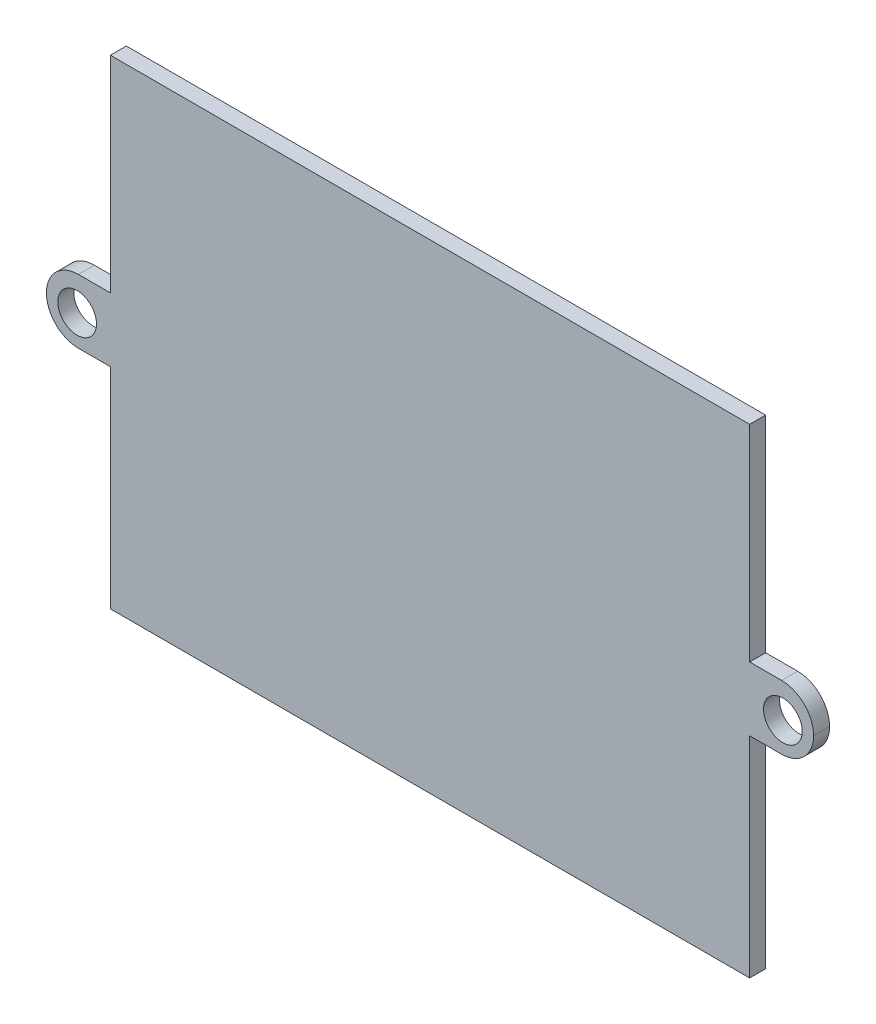
ISO-10303-21;
HEADER;
FILE_DESCRIPTION(('STEP AP214'),'2;1');
FILE_NAME('part.step','',(''),(''),'','','');
FILE_SCHEMA(('AUTOMOTIVE_DESIGN { 1 0 10303 214 1 1 1 1 }'));
ENDSEC;
DATA;
#1=APPLICATION_CONTEXT('core data for automotive mechanical design processes');
#2=APPLICATION_PROTOCOL_DEFINITION('international standard','automotive_design',2000,#1);
#3=PRODUCT_CONTEXT('',#1,'mechanical');
#4=PRODUCT('Part','Part','',(#3));
#5=PRODUCT_RELATED_PRODUCT_CATEGORY('part','',(#4));
#6=PRODUCT_DEFINITION_FORMATION('','',#4);
#7=PRODUCT_DEFINITION_CONTEXT('part definition',#1,'design');
#8=PRODUCT_DEFINITION('design','',#6,#7);
#9=PRODUCT_DEFINITION_SHAPE('','',#8);
#10=(LENGTH_UNIT() NAMED_UNIT(*) SI_UNIT(.MILLI.,.METRE.));
#11=(NAMED_UNIT(*) PLANE_ANGLE_UNIT() SI_UNIT($,.RADIAN.));
#12=(NAMED_UNIT(*) SI_UNIT($,.STERADIAN.) SOLID_ANGLE_UNIT());
#13=UNCERTAINTY_MEASURE_WITH_UNIT(LENGTH_MEASURE(1.E-05),#10,'distance_accuracy_value','');
#14=(GEOMETRIC_REPRESENTATION_CONTEXT(3) GLOBAL_UNCERTAINTY_ASSIGNED_CONTEXT((#13)) GLOBAL_UNIT_ASSIGNED_CONTEXT((#10,
#11,#12)) REPRESENTATION_CONTEXT('',''));
#15=CARTESIAN_POINT('',(0.,0.,0.));
#16=DIRECTION('',(0.,0.,1.));
#17=DIRECTION('',(1.,0.,0.));
#18=AXIS2_PLACEMENT_3D('',#15,#16,#17);
#19=CARTESIAN_POINT('',(100.,75.,5.));
#20=DIRECTION('',(-1.,0.,0.));
#21=DIRECTION('',(0.,-1.,0.));
#22=AXIS2_PLACEMENT_3D('',#19,#20,#21);
#23=PLANE('',#22);
#24=DIRECTION('',(0.,0.,-1.));
#25=VECTOR('',#24,1.);
#26=CARTESIAN_POINT('',(100.,-9.37884771933413,5.));
#27=LINE('',#26,#25);
#28=CARTESIAN_POINT('',(100.,-9.37884771933413,5.));
#29=VERTEX_POINT('',#28);
#30=CARTESIAN_POINT('',(100.,-9.37884771933413,0.));
#31=VERTEX_POINT('',#30);
#32=EDGE_CURVE('E158',#29,#31,#27,.T.);
#33=ORIENTED_EDGE('',*,*,#32,.F.);
#34=DIRECTION('',(0.,1.,0.));
#35=VECTOR('',#34,1.);
#36=CARTESIAN_POINT('',(100.,75.,5.));
#37=LINE('',#36,#35);
#38=CARTESIAN_POINT('',(100.,-75.,5.));
#39=VERTEX_POINT('',#38);
#40=EDGE_CURVE('E164',#39,#29,#37,.T.);
#41=ORIENTED_EDGE('',*,*,#40,.F.);
#42=DIRECTION('',(0.,0.,-1.));
#43=VECTOR('',#42,1.);
#44=CARTESIAN_POINT('',(100.,-75.,5.));
#45=LINE('',#44,#43);
#46=CARTESIAN_POINT('',(100.,-75.,0.));
#47=VERTEX_POINT('',#46);
#48=EDGE_CURVE('E182',#39,#47,#45,.T.);
#49=ORIENTED_EDGE('',*,*,#48,.T.);
#50=DIRECTION('',(0.,1.,0.));
#51=VECTOR('',#50,1.);
#52=CARTESIAN_POINT('',(100.,75.,0.));
#53=LINE('',#52,#51);
#54=EDGE_CURVE('E183',#47,#31,#53,.T.);
#55=ORIENTED_EDGE('',*,*,#54,.T.);
#56=EDGE_LOOP('',(#33,#41,#49,#55));
#57=FACE_BOUND('',#56,.T.);
#58=ADVANCED_FACE('F35',(#57),#23,.F.);
#59=CARTESIAN_POINT('',(-100.,75.,5.));
#60=DIRECTION('',(1.,0.,0.));
#61=DIRECTION('',(0.,0.,-1.));
#62=AXIS2_PLACEMENT_3D('',#59,#60,#61);
#63=PLANE('',#62);
#64=DIRECTION('',(0.,0.,-1.));
#65=VECTOR('',#64,1.);
#66=CARTESIAN_POINT('',(-100.,10.6211522806658,5.));
#67=LINE('',#66,#65);
#68=CARTESIAN_POINT('',(-100.,10.6211522806658,5.));
#69=VERTEX_POINT('',#68);
#70=CARTESIAN_POINT('',(-100.,10.6211522806658,0.));
#71=VERTEX_POINT('',#70);
#72=EDGE_CURVE('E173',#69,#71,#67,.T.);
#73=ORIENTED_EDGE('',*,*,#72,.F.);
#74=DIRECTION('',(0.,-1.,0.));
#75=VECTOR('',#74,1.);
#76=CARTESIAN_POINT('',(-100.,75.,5.));
#77=LINE('',#76,#75);
#78=CARTESIAN_POINT('',(-100.,75.,5.));
#79=VERTEX_POINT('',#78);
#80=EDGE_CURVE('E177',#79,#69,#77,.T.);
#81=ORIENTED_EDGE('',*,*,#80,.F.);
#82=DIRECTION('',(0.,0.,-1.));
#83=VECTOR('',#82,1.);
#84=CARTESIAN_POINT('',(-100.,75.,5.));
#85=LINE('',#84,#83);
#86=CARTESIAN_POINT('',(-100.,75.,0.));
#87=VERTEX_POINT('',#86);
#88=EDGE_CURVE('E197',#79,#87,#85,.T.);
#89=ORIENTED_EDGE('',*,*,#88,.T.);
#90=DIRECTION('',(0.,-1.,0.));
#91=VECTOR('',#90,1.);
#92=CARTESIAN_POINT('',(-100.,75.,0.));
#93=LINE('',#92,#91);
#94=EDGE_CURVE('E169',#87,#71,#93,.T.);
#95=ORIENTED_EDGE('',*,*,#94,.T.);
#96=EDGE_LOOP('',(#73,#81,#89,#95));
#97=FACE_BOUND('',#96,.T.);
#98=ADVANCED_FACE('F290',(#97),#63,.F.);
#99=CARTESIAN_POINT('',(100.,10.6211522806659,5.));
#100=VERTEX_POINT('',#99);
#101=CARTESIAN_POINT('',(100.,75.,5.));
#102=VERTEX_POINT('',#101);
#103=EDGE_CURVE('E141',#100,#102,#37,.T.);
#104=ORIENTED_EDGE('',*,*,#103,.F.);
#105=DIRECTION('',(0.,0.,-1.));
#106=VECTOR('',#105,1.);
#107=CARTESIAN_POINT('',(100.,10.6211522806659,5.));
#108=LINE('',#107,#106);
#109=CARTESIAN_POINT('',(100.,10.6211522806659,0.));
#110=VERTEX_POINT('',#109);
#111=EDGE_CURVE('E151',#100,#110,#108,.T.);
#112=ORIENTED_EDGE('',*,*,#111,.T.);
#113=CARTESIAN_POINT('',(100.,75.,0.));
#114=VERTEX_POINT('',#113);
#115=EDGE_CURVE('E187',#110,#114,#53,.T.);
#116=ORIENTED_EDGE('',*,*,#115,.T.);
#117=DIRECTION('',(0.,0.,-1.));
#118=VECTOR('',#117,1.);
#119=CARTESIAN_POINT('',(100.,75.,5.));
#120=LINE('',#119,#118);
#121=EDGE_CURVE('E163',#102,#114,#120,.T.);
#122=ORIENTED_EDGE('',*,*,#121,.F.);
#123=EDGE_LOOP('',(#104,#112,#116,#122));
#124=FACE_BOUND('',#123,.T.);
#125=ADVANCED_FACE('F161',(#124),#23,.F.);
#126=CARTESIAN_POINT('',(-100.,75.,5.));
#127=DIRECTION('',(0.,-1.,0.));
#128=DIRECTION('',(0.,0.,-1.));
#129=AXIS2_PLACEMENT_3D('',#126,#127,#128);
#130=PLANE('',#129);
#131=DIRECTION('',(-1.,0.,0.));
#132=VECTOR('',#131,1.);
#133=CARTESIAN_POINT('',(-100.,75.,0.));
#134=LINE('',#133,#132);
#135=EDGE_CURVE('E186',#114,#87,#134,.T.);
#136=ORIENTED_EDGE('',*,*,#135,.T.);
#137=ORIENTED_EDGE('',*,*,#88,.F.);
#138=DIRECTION('',(-1.,0.,0.));
#139=VECTOR('',#138,1.);
#140=CARTESIAN_POINT('',(-100.,75.,5.));
#141=LINE('',#140,#139);
#142=EDGE_CURVE('E168',#102,#79,#141,.T.);
#143=ORIENTED_EDGE('',*,*,#142,.F.);
#144=ORIENTED_EDGE('',*,*,#121,.T.);
#145=EDGE_LOOP('',(#136,#137,#143,#144));
#146=FACE_BOUND('',#145,.T.);
#147=ADVANCED_FACE('F302',(#146),#130,.F.);
#148=CARTESIAN_POINT('',(-100.,-9.37884771933416,5.));
#149=VERTEX_POINT('',#148);
#150=CARTESIAN_POINT('',(-100.,-75.,5.));
#151=VERTEX_POINT('',#150);
#152=EDGE_CURVE('E176',#149,#151,#77,.T.);
#153=ORIENTED_EDGE('',*,*,#152,.F.);
#154=DIRECTION('',(0.,0.,-1.));
#155=VECTOR('',#154,1.);
#156=CARTESIAN_POINT('',(-100.,-9.37884771933416,5.));
#157=LINE('',#156,#155);
#158=CARTESIAN_POINT('',(-100.,-9.37884771933416,0.));
#159=VERTEX_POINT('',#158);
#160=EDGE_CURVE('E257',#149,#159,#157,.T.);
#161=ORIENTED_EDGE('',*,*,#160,.T.);
#162=CARTESIAN_POINT('',(-100.,-75.,0.));
#163=VERTEX_POINT('',#162);
#164=EDGE_CURVE('E189',#159,#163,#93,.T.);
#165=ORIENTED_EDGE('',*,*,#164,.T.);
#166=DIRECTION('',(0.,0.,-1.));
#167=VECTOR('',#166,1.);
#168=CARTESIAN_POINT('',(-100.,-75.,5.));
#169=LINE('',#168,#167);
#170=EDGE_CURVE('E194',#151,#163,#169,.T.);
#171=ORIENTED_EDGE('',*,*,#170,.F.);
#172=EDGE_LOOP('',(#153,#161,#165,#171));
#173=FACE_BOUND('',#172,.T.);
#174=ADVANCED_FACE('F285',(#173),#63,.F.);
#175=CARTESIAN_POINT('',(-100.,-75.,5.));
#176=DIRECTION('',(0.,1.,0.));
#177=DIRECTION('',(0.,0.,1.));
#178=AXIS2_PLACEMENT_3D('',#175,#176,#177);
#179=PLANE('',#178);
#180=DIRECTION('',(1.,0.,0.));
#181=VECTOR('',#180,1.);
#182=CARTESIAN_POINT('',(-100.,-75.,0.));
#183=LINE('',#182,#181);
#184=EDGE_CURVE('E165',#163,#47,#183,.T.);
#185=ORIENTED_EDGE('',*,*,#184,.T.);
#186=ORIENTED_EDGE('',*,*,#48,.F.);
#187=DIRECTION('',(1.,0.,0.));
#188=VECTOR('',#187,1.);
#189=CARTESIAN_POINT('',(-100.,-75.,5.));
#190=LINE('',#189,#188);
#191=EDGE_CURVE('E180',#151,#39,#190,.T.);
#192=ORIENTED_EDGE('',*,*,#191,.F.);
#193=ORIENTED_EDGE('',*,*,#170,.T.);
#194=EDGE_LOOP('',(#185,#186,#192,#193));
#195=FACE_BOUND('',#194,.T.);
#196=ADVANCED_FACE('F278',(#195),#179,.F.);
#197=CARTESIAN_POINT('',(0.,0.,5.));
#198=DIRECTION('',(0.,0.,1.));
#199=DIRECTION('',(1.,0.,0.));
#200=AXIS2_PLACEMENT_3D('',#197,#198,#199);
#201=PLANE('',#200);
#202=DIRECTION('',(1.,0.,0.));
#203=VECTOR('',#202,1.);
#204=CARTESIAN_POINT('',(100.,-9.37884771933413,5.));
#205=LINE('',#204,#203);
#206=CARTESIAN_POINT('',(110.,-9.37884771933413,5.));
#207=VERTEX_POINT('',#206);
#208=EDGE_CURVE('E147',#29,#207,#205,.T.);
#209=ORIENTED_EDGE('',*,*,#208,.T.);
#210=CARTESIAN_POINT('',(110.,0.621152280665869,5.));
#211=DIRECTION('',(0.,0.,1.));
#212=DIRECTION('',(1.,0.,0.));
#213=AXIS2_PLACEMENT_3D('',#210,#211,#212);
#214=CIRCLE('',#213,10.);
#215=CARTESIAN_POINT('',(120.,0.621152280665888,5.));
#216=VERTEX_POINT('',#215);
#217=EDGE_CURVE('E215',#207,#216,#214,.T.);
#218=ORIENTED_EDGE('',*,*,#217,.T.);
#219=CARTESIAN_POINT('',(110.,0.621152280665873,5.));
#220=DIRECTION('',(0.,0.,1.));
#221=DIRECTION('',(1.,0.,0.));
#222=AXIS2_PLACEMENT_3D('',#219,#220,#221);
#223=CIRCLE('',#222,10.);
#224=CARTESIAN_POINT('',(110.,10.6211522806659,5.));
#225=VERTEX_POINT('',#224);
#226=EDGE_CURVE('E144',#216,#225,#223,.T.);
#227=ORIENTED_EDGE('',*,*,#226,.T.);
#228=DIRECTION('',(-1.,0.,0.));
#229=VECTOR('',#228,1.);
#230=CARTESIAN_POINT('',(100.,10.6211522806659,5.));
#231=LINE('',#230,#229);
#232=EDGE_CURVE('E135',#225,#100,#231,.T.);
#233=ORIENTED_EDGE('',*,*,#232,.T.);
#234=ORIENTED_EDGE('',*,*,#103,.T.);
#235=ORIENTED_EDGE('',*,*,#142,.T.);
#236=ORIENTED_EDGE('',*,*,#80,.T.);
#237=DIRECTION('',(-1.,0.,0.));
#238=VECTOR('',#237,1.);
#239=CARTESIAN_POINT('',(-100.,10.6211522806658,5.));
#240=LINE('',#239,#238);
#241=CARTESIAN_POINT('',(-110.,10.6211522806658,5.));
#242=VERTEX_POINT('',#241);
#243=EDGE_CURVE('E250',#69,#242,#240,.T.);
#244=ORIENTED_EDGE('',*,*,#243,.T.);
#245=CARTESIAN_POINT('',(-110.,0.621152280665844,5.));
#246=DIRECTION('',(0.,0.,1.));
#247=DIRECTION('',(1.,0.,0.));
#248=AXIS2_PLACEMENT_3D('',#245,#246,#247);
#249=CIRCLE('',#248,10.);
#250=CARTESIAN_POINT('',(-120.,0.621152280665844,5.));
#251=VERTEX_POINT('',#250);
#252=EDGE_CURVE('E57',#242,#251,#249,.T.);
#253=ORIENTED_EDGE('',*,*,#252,.T.);
#254=CARTESIAN_POINT('',(-110.,0.621152280665842,5.));
#255=DIRECTION('',(0.,0.,1.));
#256=DIRECTION('',(1.,0.,0.));
#257=AXIS2_PLACEMENT_3D('',#254,#255,#256);
#258=CIRCLE('',#257,10.);
#259=CARTESIAN_POINT('',(-110.,-9.37884771933416,5.));
#260=VERTEX_POINT('',#259);
#261=EDGE_CURVE('E52',#251,#260,#258,.T.);
#262=ORIENTED_EDGE('',*,*,#261,.T.);
#263=DIRECTION('',(1.,0.,0.));
#264=VECTOR('',#263,1.);
#265=CARTESIAN_POINT('',(-100.,-9.37884771933416,5.));
#266=LINE('',#265,#264);
#267=EDGE_CURVE('E255',#260,#149,#266,.T.);
#268=ORIENTED_EDGE('',*,*,#267,.T.);
#269=ORIENTED_EDGE('',*,*,#152,.T.);
#270=ORIENTED_EDGE('',*,*,#191,.T.);
#271=ORIENTED_EDGE('',*,*,#40,.T.);
#272=EDGE_LOOP('',(#209,#218,#227,#233,#234,#235,#236,#244,#253,#262,#268,#269,#270,#271));
#273=FACE_BOUND('',#272,.T.);
#274=CARTESIAN_POINT('',(-110.388207670039,0.,5.));
#275=DIRECTION('',(0.,0.,1.));
#276=DIRECTION('',(1.,0.,0.));
#277=AXIS2_PLACEMENT_3D('',#274,#275,#276);
#278=CIRCLE('',#277,6.05435204451022);
#279=CARTESIAN_POINT('',(-104.333855625529,0.,5.));
#280=VERTEX_POINT('',#279);
#281=EDGE_CURVE('E248',#280,#280,#278,.T.);
#282=ORIENTED_EDGE('',*,*,#281,.F.);
#283=EDGE_LOOP('',(#282));
#284=FACE_BOUND('',#283,.T.);
#285=CARTESIAN_POINT('',(110.388207670039,0.,5.));
#286=DIRECTION('',(0.,0.,1.));
#287=DIRECTION('',(-1.,0.,0.));
#288=AXIS2_PLACEMENT_3D('',#285,#286,#287);
#289=CIRCLE('',#288,6.05435204451022);
#290=CARTESIAN_POINT('',(104.333855625529,0.,5.));
#291=VERTEX_POINT('',#290);
#292=EDGE_CURVE('E227',#291,#291,#289,.T.);
#293=ORIENTED_EDGE('',*,*,#292,.F.);
#294=EDGE_LOOP('',(#293));
#295=FACE_BOUND('',#294,.T.);
#296=ADVANCED_FACE('F138',(#273,#284,#295),#201,.T.);
#297=CARTESIAN_POINT('',(0.,0.,0.));
#298=DIRECTION('',(0.,0.,1.));
#299=DIRECTION('',(1.,0.,0.));
#300=AXIS2_PLACEMENT_3D('',#297,#298,#299);
#301=PLANE('',#300);
#302=CARTESIAN_POINT('',(110.,0.621152280665873,0.));
#303=DIRECTION('',(0.,0.,1.));
#304=DIRECTION('',(1.,0.,0.));
#305=AXIS2_PLACEMENT_3D('',#302,#303,#304);
#306=CIRCLE('',#305,10.);
#307=CARTESIAN_POINT('',(110.,10.6211522806659,0.));
#308=VERTEX_POINT('',#307);
#309=CARTESIAN_POINT('',(120.,0.621152280665888,0.));
#310=VERTEX_POINT('',#309);
#311=EDGE_CURVE('E205',#308,#310,#306,.F.);
#312=ORIENTED_EDGE('',*,*,#311,.T.);
#313=CARTESIAN_POINT('',(110.,0.621152280665869,0.));
#314=DIRECTION('',(0.,0.,1.));
#315=DIRECTION('',(1.,0.,0.));
#316=AXIS2_PLACEMENT_3D('',#313,#314,#315);
#317=CIRCLE('',#316,10.);
#318=CARTESIAN_POINT('',(110.,-9.37884771933413,0.));
#319=VERTEX_POINT('',#318);
#320=EDGE_CURVE('E207',#310,#319,#317,.F.);
#321=ORIENTED_EDGE('',*,*,#320,.T.);
#322=DIRECTION('',(1.,0.,0.));
#323=VECTOR('',#322,1.);
#324=CARTESIAN_POINT('',(100.,-9.37884771933413,0.));
#325=LINE('',#324,#323);
#326=EDGE_CURVE('E148',#31,#319,#325,.T.);
#327=ORIENTED_EDGE('',*,*,#326,.F.);
#328=ORIENTED_EDGE('',*,*,#54,.F.);
#329=ORIENTED_EDGE('',*,*,#184,.F.);
#330=ORIENTED_EDGE('',*,*,#164,.F.);
#331=DIRECTION('',(1.,0.,0.));
#332=VECTOR('',#331,1.);
#333=CARTESIAN_POINT('',(-100.,-9.37884771933416,0.));
#334=LINE('',#333,#332);
#335=CARTESIAN_POINT('',(-110.,-9.37884771933416,0.));
#336=VERTEX_POINT('',#335);
#337=EDGE_CURVE('E247',#336,#159,#334,.T.);
#338=ORIENTED_EDGE('',*,*,#337,.F.);
#339=CARTESIAN_POINT('',(-110.,0.621152280665842,0.));
#340=DIRECTION('',(0.,0.,1.));
#341=DIRECTION('',(1.,0.,0.));
#342=AXIS2_PLACEMENT_3D('',#339,#340,#341);
#343=CIRCLE('',#342,10.);
#344=CARTESIAN_POINT('',(-120.,0.621152280665844,0.));
#345=VERTEX_POINT('',#344);
#346=EDGE_CURVE('E203',#336,#345,#343,.F.);
#347=ORIENTED_EDGE('',*,*,#346,.T.);
#348=CARTESIAN_POINT('',(-110.,0.621152280665844,0.));
#349=DIRECTION('',(0.,0.,1.));
#350=DIRECTION('',(1.,0.,0.));
#351=AXIS2_PLACEMENT_3D('',#348,#349,#350);
#352=CIRCLE('',#351,10.);
#353=CARTESIAN_POINT('',(-110.,10.6211522806658,0.));
#354=VERTEX_POINT('',#353);
#355=EDGE_CURVE('E201',#345,#354,#352,.F.);
#356=ORIENTED_EDGE('',*,*,#355,.T.);
#357=DIRECTION('',(-1.,0.,0.));
#358=VECTOR('',#357,1.);
#359=CARTESIAN_POINT('',(-100.,10.6211522806658,0.));
#360=LINE('',#359,#358);
#361=EDGE_CURVE('E241',#71,#354,#360,.T.);
#362=ORIENTED_EDGE('',*,*,#361,.F.);
#363=ORIENTED_EDGE('',*,*,#94,.F.);
#364=ORIENTED_EDGE('',*,*,#135,.F.);
#365=ORIENTED_EDGE('',*,*,#115,.F.);
#366=DIRECTION('',(-1.,0.,0.));
#367=VECTOR('',#366,1.);
#368=CARTESIAN_POINT('',(100.,10.6211522806659,0.));
#369=LINE('',#368,#367);
#370=EDGE_CURVE('E154',#308,#110,#369,.T.);
#371=ORIENTED_EDGE('',*,*,#370,.F.);
#372=EDGE_LOOP('',(#312,#321,#327,#328,#329,#330,#338,#347,#356,#362,#363,#364,#365,#371));
#373=FACE_BOUND('',#372,.T.);
#374=CARTESIAN_POINT('',(-110.388207670039,0.,0.));
#375=DIRECTION('',(0.,0.,1.));
#376=DIRECTION('',(1.,0.,0.));
#377=AXIS2_PLACEMENT_3D('',#374,#375,#376);
#378=CIRCLE('',#377,6.05435204451022);
#379=CARTESIAN_POINT('',(-104.333855625529,0.,0.));
#380=VERTEX_POINT('',#379);
#381=EDGE_CURVE('E157',#380,#380,#378,.T.);
#382=ORIENTED_EDGE('',*,*,#381,.T.);
#383=EDGE_LOOP('',(#382));
#384=FACE_BOUND('',#383,.T.);
#385=CARTESIAN_POINT('',(110.388207670039,0.,0.));
#386=DIRECTION('',(0.,0.,1.));
#387=DIRECTION('',(-1.,0.,0.));
#388=AXIS2_PLACEMENT_3D('',#385,#386,#387);
#389=CIRCLE('',#388,6.05435204451022);
#390=CARTESIAN_POINT('',(104.333855625529,0.,0.));
#391=VERTEX_POINT('',#390);
#392=EDGE_CURVE('E222',#391,#391,#389,.T.);
#393=ORIENTED_EDGE('',*,*,#392,.T.);
#394=EDGE_LOOP('',(#393));
#395=FACE_BOUND('',#394,.T.);
#396=ADVANCED_FACE('F238',(#373,#384,#395),#301,.F.);
#397=CARTESIAN_POINT('',(-100.,10.6211522806658,5.));
#398=DIRECTION('',(0.,-1.,0.));
#399=DIRECTION('',(1.,0.,0.));
#400=AXIS2_PLACEMENT_3D('',#397,#398,#399);
#401=PLANE('',#400);
#402=ORIENTED_EDGE('',*,*,#361,.T.);
#403=DIRECTION('',(0.,0.,-1.));
#404=VECTOR('',#403,1.);
#405=CARTESIAN_POINT('',(-110.,10.6211522806658,5.));
#406=LINE('',#405,#404);
#407=EDGE_CURVE('E11',#354,#242,#406,.F.);
#408=ORIENTED_EDGE('',*,*,#407,.T.);
#409=ORIENTED_EDGE('',*,*,#243,.F.);
#410=ORIENTED_EDGE('',*,*,#72,.T.);
#411=EDGE_LOOP('',(#402,#408,#409,#410));
#412=FACE_BOUND('',#411,.T.);
#413=ADVANCED_FACE('F245',(#412),#401,.F.);
#414=CARTESIAN_POINT('',(-100.,-9.37884771933416,5.));
#415=DIRECTION('',(0.,1.,0.));
#416=DIRECTION('',(-1.,0.,0.));
#417=AXIS2_PLACEMENT_3D('',#414,#415,#416);
#418=PLANE('',#417);
#419=ORIENTED_EDGE('',*,*,#267,.F.);
#420=DIRECTION('',(0.,0.,-1.));
#421=VECTOR('',#420,1.);
#422=CARTESIAN_POINT('',(-110.,-9.37884771933416,5.));
#423=LINE('',#422,#421);
#424=EDGE_CURVE('E44',#260,#336,#423,.T.);
#425=ORIENTED_EDGE('',*,*,#424,.T.);
#426=ORIENTED_EDGE('',*,*,#337,.T.);
#427=ORIENTED_EDGE('',*,*,#160,.F.);
#428=EDGE_LOOP('',(#419,#425,#426,#427));
#429=FACE_BOUND('',#428,.T.);
#430=ADVANCED_FACE('F328',(#429),#418,.F.);
#431=CARTESIAN_POINT('',(-110.388207670039,0.,5.));
#432=DIRECTION('',(0.,0.,-1.));
#433=DIRECTION('',(-1.,0.,0.));
#434=AXIS2_PLACEMENT_3D('',#431,#432,#433);
#435=CYLINDRICAL_SURFACE('',#434,6.05435204451022);
#436=ORIENTED_EDGE('',*,*,#281,.T.);
#437=EDGE_LOOP('',(#436));
#438=FACE_BOUND('',#437,.T.);
#439=ORIENTED_EDGE('',*,*,#381,.F.);
#440=EDGE_LOOP('',(#439));
#441=FACE_BOUND('',#440,.T.);
#442=ADVANCED_FACE('F330',(#438,#441),#435,.F.);
#443=CARTESIAN_POINT('',(100.,10.6211522806659,5.));
#444=DIRECTION('',(0.,-1.,0.));
#445=DIRECTION('',(1.,0.,0.));
#446=AXIS2_PLACEMENT_3D('',#443,#444,#445);
#447=PLANE('',#446);
#448=ORIENTED_EDGE('',*,*,#232,.F.);
#449=DIRECTION('',(0.,0.,-1.));
#450=VECTOR('',#449,1.);
#451=CARTESIAN_POINT('',(110.,10.6211522806659,5.));
#452=LINE('',#451,#450);
#453=EDGE_CURVE('E217',#225,#308,#452,.T.);
#454=ORIENTED_EDGE('',*,*,#453,.T.);
#455=ORIENTED_EDGE('',*,*,#370,.T.);
#456=ORIENTED_EDGE('',*,*,#111,.F.);
#457=EDGE_LOOP('',(#448,#454,#455,#456));
#458=FACE_BOUND('',#457,.T.);
#459=ADVANCED_FACE('F152',(#458),#447,.F.);
#460=CARTESIAN_POINT('',(100.,-9.37884771933413,5.));
#461=DIRECTION('',(0.,1.,0.));
#462=DIRECTION('',(-1.,0.,0.));
#463=AXIS2_PLACEMENT_3D('',#460,#461,#462);
#464=PLANE('',#463);
#465=ORIENTED_EDGE('',*,*,#326,.T.);
#466=DIRECTION('',(0.,0.,-1.));
#467=VECTOR('',#466,1.);
#468=CARTESIAN_POINT('',(110.,-9.37884771933413,5.));
#469=LINE('',#468,#467);
#470=EDGE_CURVE('E209',#319,#207,#469,.F.);
#471=ORIENTED_EDGE('',*,*,#470,.T.);
#472=ORIENTED_EDGE('',*,*,#208,.F.);
#473=ORIENTED_EDGE('',*,*,#32,.T.);
#474=EDGE_LOOP('',(#465,#471,#472,#473));
#475=FACE_BOUND('',#474,.T.);
#476=ADVANCED_FACE('F321',(#475),#464,.F.);
#477=CARTESIAN_POINT('',(110.388207670039,0.,5.));
#478=DIRECTION('',(0.,0.,-1.));
#479=DIRECTION('',(-1.,0.,0.));
#480=AXIS2_PLACEMENT_3D('',#477,#478,#479);
#481=CYLINDRICAL_SURFACE('',#480,6.05435204451022);
#482=ORIENTED_EDGE('',*,*,#292,.T.);
#483=EDGE_LOOP('',(#482));
#484=FACE_BOUND('',#483,.T.);
#485=ORIENTED_EDGE('',*,*,#392,.F.);
#486=EDGE_LOOP('',(#485));
#487=FACE_BOUND('',#486,.T.);
#488=ADVANCED_FACE('F274',(#484,#487),#481,.F.);
#489=CARTESIAN_POINT('',(110.,0.621152280665873,5.));
#490=DIRECTION('',(0.,0.,-1.));
#491=DIRECTION('',(-1.,0.,0.));
#492=AXIS2_PLACEMENT_3D('',#489,#490,#491);
#493=CYLINDRICAL_SURFACE('',#492,10.);
#494=ORIENTED_EDGE('',*,*,#453,.F.);
#495=ORIENTED_EDGE('',*,*,#226,.F.);
#496=DIRECTION('',(0.,0.,-1.));
#497=VECTOR('',#496,1.);
#498=CARTESIAN_POINT('',(120.,0.621152280665888,5.));
#499=LINE('',#498,#497);
#500=EDGE_CURVE('E220',#310,#216,#499,.F.);
#501=ORIENTED_EDGE('',*,*,#500,.F.);
#502=ORIENTED_EDGE('',*,*,#311,.F.);
#503=EDGE_LOOP('',(#494,#495,#501,#502));
#504=FACE_BOUND('',#503,.T.);
#505=ADVANCED_FACE('F315',(#504),#493,.T.);
#506=CARTESIAN_POINT('',(110.,0.621152280665869,5.));
#507=DIRECTION('',(0.,0.,-1.));
#508=DIRECTION('',(-1.,0.,0.));
#509=AXIS2_PLACEMENT_3D('',#506,#507,#508);
#510=CYLINDRICAL_SURFACE('',#509,10.);
#511=ORIENTED_EDGE('',*,*,#217,.F.);
#512=ORIENTED_EDGE('',*,*,#470,.F.);
#513=ORIENTED_EDGE('',*,*,#320,.F.);
#514=ORIENTED_EDGE('',*,*,#500,.T.);
#515=EDGE_LOOP('',(#511,#512,#513,#514));
#516=FACE_BOUND('',#515,.T.);
#517=ADVANCED_FACE('F317',(#516),#510,.T.);
#518=CARTESIAN_POINT('',(-110.,0.621152280665844,5.));
#519=DIRECTION('',(0.,0.,-1.));
#520=DIRECTION('',(-1.,0.,0.));
#521=AXIS2_PLACEMENT_3D('',#518,#519,#520);
#522=CYLINDRICAL_SURFACE('',#521,10.);
#523=DIRECTION('',(0.,0.,-1.));
#524=VECTOR('',#523,1.);
#525=CARTESIAN_POINT('',(-120.,0.621152280665844,5.));
#526=LINE('',#525,#524);
#527=EDGE_CURVE('E39',#251,#345,#526,.T.);
#528=ORIENTED_EDGE('',*,*,#527,.F.);
#529=ORIENTED_EDGE('',*,*,#252,.F.);
#530=ORIENTED_EDGE('',*,*,#407,.F.);
#531=ORIENTED_EDGE('',*,*,#355,.F.);
#532=EDGE_LOOP('',(#528,#529,#530,#531));
#533=FACE_BOUND('',#532,.T.);
#534=ADVANCED_FACE('F37',(#533),#522,.T.);
#535=CARTESIAN_POINT('',(-110.,0.621152280665842,5.));
#536=DIRECTION('',(0.,0.,-1.));
#537=DIRECTION('',(-1.,0.,0.));
#538=AXIS2_PLACEMENT_3D('',#535,#536,#537);
#539=CYLINDRICAL_SURFACE('',#538,10.);
#540=ORIENTED_EDGE('',*,*,#261,.F.);
#541=ORIENTED_EDGE('',*,*,#527,.T.);
#542=ORIENTED_EDGE('',*,*,#346,.F.);
#543=ORIENTED_EDGE('',*,*,#424,.F.);
#544=EDGE_LOOP('',(#540,#541,#542,#543));
#545=FACE_BOUND('',#544,.T.);
#546=ADVANCED_FACE('F231',(#545),#539,.T.);
#547=CLOSED_SHELL('',(#58,#98,#125,#147,#174,#196,#296,#396,#413,#430,#442,#459,#476,#488,#505,
#517,#534,#546));
#548=MANIFOLD_SOLID_BREP('B2',#547);
#549=ADVANCED_BREP_SHAPE_REPRESENTATION('',(#18,#548),#14);
#550=SHAPE_DEFINITION_REPRESENTATION(#9,#549);
ENDSEC;
END-ISO-10303-21;
